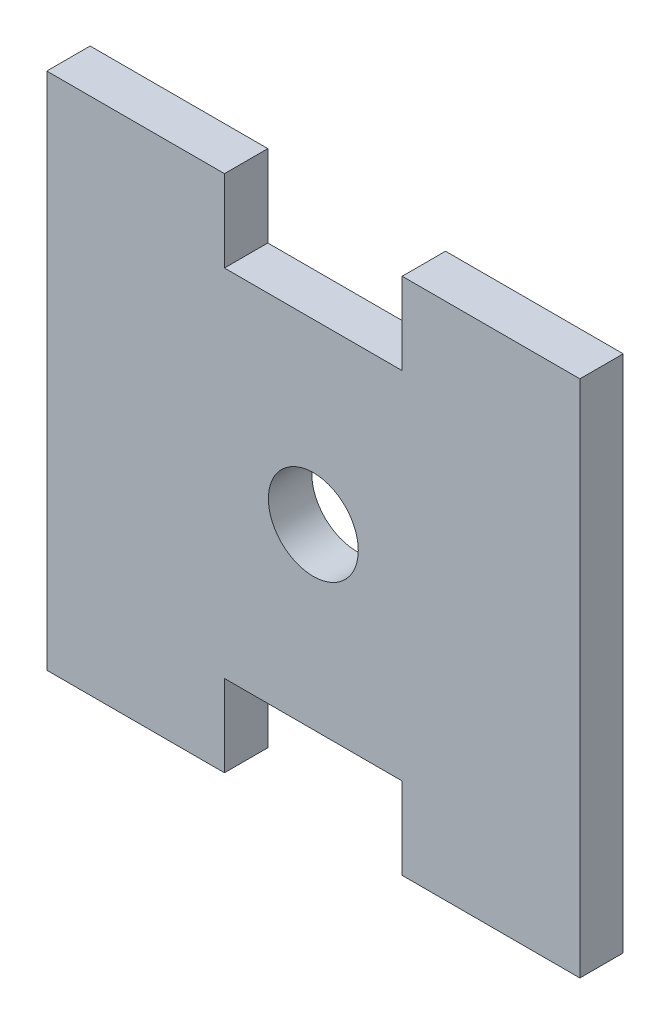
ISO-10303-21;
HEADER;
FILE_DESCRIPTION(('STEP AP214'),'2;1');
FILE_NAME('part.step','',(''),(''),'','','');
FILE_SCHEMA(('AUTOMOTIVE_DESIGN { 1 0 10303 214 1 1 1 1 }'));
ENDSEC;
DATA;
#1=APPLICATION_CONTEXT('core data for automotive mechanical design processes');
#2=APPLICATION_PROTOCOL_DEFINITION('international standard','automotive_design',2000,#1);
#3=PRODUCT_CONTEXT('',#1,'mechanical');
#4=PRODUCT('Part','Part','',(#3));
#5=PRODUCT_RELATED_PRODUCT_CATEGORY('part','',(#4));
#6=PRODUCT_DEFINITION_FORMATION('','',#4);
#7=PRODUCT_DEFINITION_CONTEXT('part definition',#1,'design');
#8=PRODUCT_DEFINITION('design','',#6,#7);
#9=PRODUCT_DEFINITION_SHAPE('','',#8);
#10=(LENGTH_UNIT() NAMED_UNIT(*) SI_UNIT(.MILLI.,.METRE.));
#11=(NAMED_UNIT(*) PLANE_ANGLE_UNIT() SI_UNIT($,.RADIAN.));
#12=(NAMED_UNIT(*) SI_UNIT($,.STERADIAN.) SOLID_ANGLE_UNIT());
#13=UNCERTAINTY_MEASURE_WITH_UNIT(LENGTH_MEASURE(1.E-05),#10,'distance_accuracy_value','');
#14=(GEOMETRIC_REPRESENTATION_CONTEXT(3) GLOBAL_UNCERTAINTY_ASSIGNED_CONTEXT((#13)) GLOBAL_UNIT_ASSIGNED_CONTEXT((#10,
#11,#12)) REPRESENTATION_CONTEXT('',''));
#15=CARTESIAN_POINT('',(0.,0.,0.));
#16=DIRECTION('',(0.,0.,1.));
#17=DIRECTION('',(1.,0.,0.));
#18=AXIS2_PLACEMENT_3D('',#15,#16,#17);
#19=CARTESIAN_POINT('',(-19.05,0.,3.0988));
#20=DIRECTION('',(-1.,0.,0.));
#21=DIRECTION('',(0.,-1.,0.));
#22=AXIS2_PLACEMENT_3D('',#19,#20,#21);
#23=PLANE('',#22);
#24=DIRECTION('',(0.,1.,0.));
#25=VECTOR('',#24,1.);
#26=CARTESIAN_POINT('',(-19.05,0.,0.));
#27=LINE('',#26,#25);
#28=CARTESIAN_POINT('',(-19.05,-18.542,0.));
#29=VERTEX_POINT('',#28);
#30=CARTESIAN_POINT('',(-19.05,18.542,0.));
#31=VERTEX_POINT('',#30);
#32=EDGE_CURVE('E156',#29,#31,#27,.T.);
#33=ORIENTED_EDGE('',*,*,#32,.F.);
#34=DIRECTION('',(0.,0.,-1.));
#35=VECTOR('',#34,1.);
#36=CARTESIAN_POINT('',(-19.05,-18.542,3.0988));
#37=LINE('',#36,#35);
#38=CARTESIAN_POINT('',(-19.05,-18.542,3.0988));
#39=VERTEX_POINT('',#38);
#40=EDGE_CURVE('E11',#39,#29,#37,.T.);
#41=ORIENTED_EDGE('',*,*,#40,.F.);
#42=DIRECTION('',(0.,1.,0.));
#43=VECTOR('',#42,1.);
#44=CARTESIAN_POINT('',(-19.05,0.,3.0988));
#45=LINE('',#44,#43);
#46=CARTESIAN_POINT('',(-19.05,18.542,3.0988));
#47=VERTEX_POINT('',#46);
#48=EDGE_CURVE('E268',#39,#47,#45,.T.);
#49=ORIENTED_EDGE('',*,*,#48,.T.);
#50=DIRECTION('',(0.,0.,-1.));
#51=VECTOR('',#50,1.);
#52=CARTESIAN_POINT('',(-19.05,18.542,3.0988));
#53=LINE('',#52,#51);
#54=EDGE_CURVE('E52',#47,#31,#53,.T.);
#55=ORIENTED_EDGE('',*,*,#54,.T.);
#56=EDGE_LOOP('',(#33,#41,#49,#55));
#57=FACE_BOUND('',#56,.T.);
#58=ADVANCED_FACE('F35',(#57),#23,.T.);
#59=CARTESIAN_POINT('',(0.,-18.542,3.0988));
#60=DIRECTION('',(0.,1.,0.));
#61=DIRECTION('',(0.,0.,1.));
#62=AXIS2_PLACEMENT_3D('',#59,#60,#61);
#63=PLANE('',#62);
#64=DIRECTION('',(1.,0.,0.));
#65=VECTOR('',#64,1.);
#66=CARTESIAN_POINT('',(0.,-18.542,0.));
#67=LINE('',#66,#65);
#68=CARTESIAN_POINT('',(-6.35,-18.542,0.));
#69=VERTEX_POINT('',#68);
#70=EDGE_CURVE('E158',#29,#69,#67,.T.);
#71=ORIENTED_EDGE('',*,*,#70,.T.);
#72=DIRECTION('',(0.,0.,-1.));
#73=VECTOR('',#72,1.);
#74=CARTESIAN_POINT('',(-6.35,-18.542,3.0988));
#75=LINE('',#74,#73);
#76=CARTESIAN_POINT('',(-6.35,-18.542,3.0988));
#77=VERTEX_POINT('',#76);
#78=EDGE_CURVE('E44',#77,#69,#75,.T.);
#79=ORIENTED_EDGE('',*,*,#78,.F.);
#80=DIRECTION('',(1.,0.,0.));
#81=VECTOR('',#80,1.);
#82=CARTESIAN_POINT('',(0.,-18.542,3.0988));
#83=LINE('',#82,#81);
#84=EDGE_CURVE('E270',#39,#77,#83,.T.);
#85=ORIENTED_EDGE('',*,*,#84,.F.);
#86=ORIENTED_EDGE('',*,*,#40,.T.);
#87=EDGE_LOOP('',(#71,#79,#85,#86));
#88=FACE_BOUND('',#87,.T.);
#89=ADVANCED_FACE('F216',(#88),#63,.F.);
#90=CARTESIAN_POINT('',(-6.35,0.,3.0988));
#91=DIRECTION('',(-1.,0.,0.));
#92=DIRECTION('',(0.,0.,1.));
#93=AXIS2_PLACEMENT_3D('',#90,#91,#92);
#94=PLANE('',#93);
#95=DIRECTION('',(0.,1.,0.));
#96=VECTOR('',#95,1.);
#97=CARTESIAN_POINT('',(-6.35,0.,0.));
#98=LINE('',#97,#96);
#99=CARTESIAN_POINT('',(-6.35,-12.7,0.));
#100=VERTEX_POINT('',#99);
#101=EDGE_CURVE('E161',#69,#100,#98,.T.);
#102=ORIENTED_EDGE('',*,*,#101,.T.);
#103=DIRECTION('',(0.,0.,-1.));
#104=VECTOR('',#103,1.);
#105=CARTESIAN_POINT('',(-6.35,-12.7,3.0988));
#106=LINE('',#105,#104);
#107=CARTESIAN_POINT('',(-6.35,-12.7,3.0988));
#108=VERTEX_POINT('',#107);
#109=EDGE_CURVE('E204',#108,#100,#106,.T.);
#110=ORIENTED_EDGE('',*,*,#109,.F.);
#111=DIRECTION('',(0.,1.,0.));
#112=VECTOR('',#111,1.);
#113=CARTESIAN_POINT('',(-6.35,0.,3.0988));
#114=LINE('',#113,#112);
#115=EDGE_CURVE('E212',#77,#108,#114,.T.);
#116=ORIENTED_EDGE('',*,*,#115,.F.);
#117=ORIENTED_EDGE('',*,*,#78,.T.);
#118=EDGE_LOOP('',(#102,#110,#116,#117));
#119=FACE_BOUND('',#118,.T.);
#120=ADVANCED_FACE('F209',(#119),#94,.F.);
#121=CARTESIAN_POINT('',(0.,-12.7,3.0988));
#122=DIRECTION('',(0.,1.,0.));
#123=DIRECTION('',(0.,0.,1.));
#124=AXIS2_PLACEMENT_3D('',#121,#122,#123);
#125=PLANE('',#124);
#126=DIRECTION('',(1.,0.,0.));
#127=VECTOR('',#126,1.);
#128=CARTESIAN_POINT('',(0.,-12.7,0.));
#129=LINE('',#128,#127);
#130=CARTESIAN_POINT('',(6.35,-12.7,0.));
#131=VERTEX_POINT('',#130);
#132=EDGE_CURVE('E164',#100,#131,#129,.T.);
#133=ORIENTED_EDGE('',*,*,#132,.T.);
#134=DIRECTION('',(0.,0.,-1.));
#135=VECTOR('',#134,1.);
#136=CARTESIAN_POINT('',(6.35,-12.7,3.0988));
#137=LINE('',#136,#135);
#138=CARTESIAN_POINT('',(6.35,-12.7,3.0988));
#139=VERTEX_POINT('',#138);
#140=EDGE_CURVE('E202',#139,#131,#137,.T.);
#141=ORIENTED_EDGE('',*,*,#140,.F.);
#142=DIRECTION('',(1.,0.,0.));
#143=VECTOR('',#142,1.);
#144=CARTESIAN_POINT('',(0.,-12.7,3.0988));
#145=LINE('',#144,#143);
#146=EDGE_CURVE('E275',#108,#139,#145,.T.);
#147=ORIENTED_EDGE('',*,*,#146,.F.);
#148=ORIENTED_EDGE('',*,*,#109,.T.);
#149=EDGE_LOOP('',(#133,#141,#147,#148));
#150=FACE_BOUND('',#149,.T.);
#151=ADVANCED_FACE('F227',(#150),#125,.F.);
#152=CARTESIAN_POINT('',(6.35,0.,3.0988));
#153=DIRECTION('',(-1.,0.,0.));
#154=DIRECTION('',(0.,0.,1.));
#155=AXIS2_PLACEMENT_3D('',#152,#153,#154);
#156=PLANE('',#155);
#157=DIRECTION('',(0.,1.,0.));
#158=VECTOR('',#157,1.);
#159=CARTESIAN_POINT('',(6.35,0.,0.));
#160=LINE('',#159,#158);
#161=CARTESIAN_POINT('',(6.35,-18.542,0.));
#162=VERTEX_POINT('',#161);
#163=EDGE_CURVE('E167',#162,#131,#160,.T.);
#164=ORIENTED_EDGE('',*,*,#163,.F.);
#165=DIRECTION('',(0.,0.,-1.));
#166=VECTOR('',#165,1.);
#167=CARTESIAN_POINT('',(6.35,-18.542,3.0988));
#168=LINE('',#167,#166);
#169=CARTESIAN_POINT('',(6.35,-18.542,3.0988));
#170=VERTEX_POINT('',#169);
#171=EDGE_CURVE('E200',#170,#162,#168,.T.);
#172=ORIENTED_EDGE('',*,*,#171,.F.);
#173=DIRECTION('',(0.,1.,0.));
#174=VECTOR('',#173,1.);
#175=CARTESIAN_POINT('',(6.35,0.,3.0988));
#176=LINE('',#175,#174);
#177=EDGE_CURVE('E277',#170,#139,#176,.T.);
#178=ORIENTED_EDGE('',*,*,#177,.T.);
#179=ORIENTED_EDGE('',*,*,#140,.T.);
#180=EDGE_LOOP('',(#164,#172,#178,#179));
#181=FACE_BOUND('',#180,.T.);
#182=ADVANCED_FACE('F230',(#181),#156,.T.);
#183=CARTESIAN_POINT('',(0.,-18.542,3.0988));
#184=DIRECTION('',(0.,-1.,0.));
#185=DIRECTION('',(0.,0.,-1.));
#186=AXIS2_PLACEMENT_3D('',#183,#184,#185);
#187=PLANE('',#186);
#188=DIRECTION('',(-1.,0.,0.));
#189=VECTOR('',#188,1.);
#190=CARTESIAN_POINT('',(0.,-18.542,0.));
#191=LINE('',#190,#189);
#192=CARTESIAN_POINT('',(19.05,-18.542,0.));
#193=VERTEX_POINT('',#192);
#194=EDGE_CURVE('E170',#193,#162,#191,.T.);
#195=ORIENTED_EDGE('',*,*,#194,.F.);
#196=DIRECTION('',(0.,0.,-1.));
#197=VECTOR('',#196,1.);
#198=CARTESIAN_POINT('',(19.05,-18.542,3.0988));
#199=LINE('',#198,#197);
#200=CARTESIAN_POINT('',(19.05,-18.542,3.0988));
#201=VERTEX_POINT('',#200);
#202=EDGE_CURVE('E198',#201,#193,#199,.T.);
#203=ORIENTED_EDGE('',*,*,#202,.F.);
#204=DIRECTION('',(-1.,0.,0.));
#205=VECTOR('',#204,1.);
#206=CARTESIAN_POINT('',(0.,-18.542,3.0988));
#207=LINE('',#206,#205);
#208=EDGE_CURVE('E280',#201,#170,#207,.T.);
#209=ORIENTED_EDGE('',*,*,#208,.T.);
#210=ORIENTED_EDGE('',*,*,#171,.T.);
#211=EDGE_LOOP('',(#195,#203,#209,#210));
#212=FACE_BOUND('',#211,.T.);
#213=ADVANCED_FACE('F234',(#212),#187,.T.);
#214=CARTESIAN_POINT('',(19.05,0.,3.0988));
#215=DIRECTION('',(-1.,0.,0.));
#216=DIRECTION('',(0.,-1.,0.));
#217=AXIS2_PLACEMENT_3D('',#214,#215,#216);
#218=PLANE('',#217);
#219=DIRECTION('',(0.,1.,0.));
#220=VECTOR('',#219,1.);
#221=CARTESIAN_POINT('',(19.05,0.,0.));
#222=LINE('',#221,#220);
#223=CARTESIAN_POINT('',(19.05,18.542,0.));
#224=VERTEX_POINT('',#223);
#225=EDGE_CURVE('E173',#193,#224,#222,.T.);
#226=ORIENTED_EDGE('',*,*,#225,.T.);
#227=DIRECTION('',(0.,0.,-1.));
#228=VECTOR('',#227,1.);
#229=CARTESIAN_POINT('',(19.05,18.542,3.0988));
#230=LINE('',#229,#228);
#231=CARTESIAN_POINT('',(19.05,18.542,3.0988));
#232=VERTEX_POINT('',#231);
#233=EDGE_CURVE('E195',#232,#224,#230,.T.);
#234=ORIENTED_EDGE('',*,*,#233,.F.);
#235=DIRECTION('',(0.,1.,0.));
#236=VECTOR('',#235,1.);
#237=CARTESIAN_POINT('',(19.05,0.,3.0988));
#238=LINE('',#237,#236);
#239=EDGE_CURVE('E283',#201,#232,#238,.T.);
#240=ORIENTED_EDGE('',*,*,#239,.F.);
#241=ORIENTED_EDGE('',*,*,#202,.T.);
#242=EDGE_LOOP('',(#226,#234,#240,#241));
#243=FACE_BOUND('',#242,.T.);
#244=ADVANCED_FACE('F238',(#243),#218,.F.);
#245=CARTESIAN_POINT('',(0.,18.542,3.0988));
#246=DIRECTION('',(0.,-1.,0.));
#247=DIRECTION('',(0.,0.,-1.));
#248=AXIS2_PLACEMENT_3D('',#245,#246,#247);
#249=PLANE('',#248);
#250=DIRECTION('',(-1.,0.,0.));
#251=VECTOR('',#250,1.);
#252=CARTESIAN_POINT('',(0.,18.542,0.));
#253=LINE('',#252,#251);
#254=CARTESIAN_POINT('',(6.35,18.542,0.));
#255=VERTEX_POINT('',#254);
#256=EDGE_CURVE('E176',#224,#255,#253,.T.);
#257=ORIENTED_EDGE('',*,*,#256,.T.);
#258=DIRECTION('',(0.,0.,-1.));
#259=VECTOR('',#258,1.);
#260=CARTESIAN_POINT('',(6.35,18.542,3.0988));
#261=LINE('',#260,#259);
#262=CARTESIAN_POINT('',(6.35,18.542,3.0988));
#263=VERTEX_POINT('',#262);
#264=EDGE_CURVE('E192',#263,#255,#261,.T.);
#265=ORIENTED_EDGE('',*,*,#264,.F.);
#266=DIRECTION('',(-1.,0.,0.));
#267=VECTOR('',#266,1.);
#268=CARTESIAN_POINT('',(0.,18.542,3.0988));
#269=LINE('',#268,#267);
#270=EDGE_CURVE('E286',#232,#263,#269,.T.);
#271=ORIENTED_EDGE('',*,*,#270,.F.);
#272=ORIENTED_EDGE('',*,*,#233,.T.);
#273=EDGE_LOOP('',(#257,#265,#271,#272));
#274=FACE_BOUND('',#273,.T.);
#275=ADVANCED_FACE('F242',(#274),#249,.F.);
#276=CARTESIAN_POINT('',(6.35,0.,3.0988));
#277=DIRECTION('',(1.,0.,0.));
#278=DIRECTION('',(0.,0.,-1.));
#279=AXIS2_PLACEMENT_3D('',#276,#277,#278);
#280=PLANE('',#279);
#281=DIRECTION('',(0.,-1.,0.));
#282=VECTOR('',#281,1.);
#283=CARTESIAN_POINT('',(6.35,0.,0.));
#284=LINE('',#283,#282);
#285=CARTESIAN_POINT('',(6.35,12.7,0.));
#286=VERTEX_POINT('',#285);
#287=EDGE_CURVE('E179',#255,#286,#284,.T.);
#288=ORIENTED_EDGE('',*,*,#287,.T.);
#289=DIRECTION('',(0.,0.,-1.));
#290=VECTOR('',#289,1.);
#291=CARTESIAN_POINT('',(6.35,12.7,3.0988));
#292=LINE('',#291,#290);
#293=CARTESIAN_POINT('',(6.35,12.7,3.0988));
#294=VERTEX_POINT('',#293);
#295=EDGE_CURVE('E135',#294,#286,#292,.T.);
#296=ORIENTED_EDGE('',*,*,#295,.F.);
#297=DIRECTION('',(0.,-1.,0.));
#298=VECTOR('',#297,1.);
#299=CARTESIAN_POINT('',(6.35,0.,3.0988));
#300=LINE('',#299,#298);
#301=EDGE_CURVE('E144',#263,#294,#300,.T.);
#302=ORIENTED_EDGE('',*,*,#301,.F.);
#303=ORIENTED_EDGE('',*,*,#264,.T.);
#304=EDGE_LOOP('',(#288,#296,#302,#303));
#305=FACE_BOUND('',#304,.T.);
#306=ADVANCED_FACE('F246',(#305),#280,.F.);
#307=CARTESIAN_POINT('',(0.,12.7,3.0988));
#308=DIRECTION('',(0.,1.,0.));
#309=DIRECTION('',(0.,0.,1.));
#310=AXIS2_PLACEMENT_3D('',#307,#308,#309);
#311=PLANE('',#310);
#312=DIRECTION('',(1.,0.,0.));
#313=VECTOR('',#312,1.);
#314=CARTESIAN_POINT('',(0.,12.7,0.));
#315=LINE('',#314,#313);
#316=CARTESIAN_POINT('',(-6.35,12.7,0.));
#317=VERTEX_POINT('',#316);
#318=EDGE_CURVE('E131',#317,#286,#315,.T.);
#319=ORIENTED_EDGE('',*,*,#318,.F.);
#320=DIRECTION('',(0.,0.,-1.));
#321=VECTOR('',#320,1.);
#322=CARTESIAN_POINT('',(-6.35,12.7,3.0988));
#323=LINE('',#322,#321);
#324=CARTESIAN_POINT('',(-6.35,12.7,3.0988));
#325=VERTEX_POINT('',#324);
#326=EDGE_CURVE('E126',#325,#317,#323,.T.);
#327=ORIENTED_EDGE('',*,*,#326,.F.);
#328=DIRECTION('',(1.,0.,0.));
#329=VECTOR('',#328,1.);
#330=CARTESIAN_POINT('',(0.,12.7,3.0988));
#331=LINE('',#330,#329);
#332=EDGE_CURVE('E129',#325,#294,#331,.T.);
#333=ORIENTED_EDGE('',*,*,#332,.T.);
#334=ORIENTED_EDGE('',*,*,#295,.T.);
#335=EDGE_LOOP('',(#319,#327,#333,#334));
#336=FACE_BOUND('',#335,.T.);
#337=ADVANCED_FACE('F128',(#336),#311,.T.);
#338=CARTESIAN_POINT('',(-6.35,0.,3.0988));
#339=DIRECTION('',(1.,0.,0.));
#340=DIRECTION('',(0.,0.,-1.));
#341=AXIS2_PLACEMENT_3D('',#338,#339,#340);
#342=PLANE('',#341);
#343=DIRECTION('',(0.,-1.,0.));
#344=VECTOR('',#343,1.);
#345=CARTESIAN_POINT('',(-6.35,0.,0.));
#346=LINE('',#345,#344);
#347=CARTESIAN_POINT('',(-6.35,18.542,0.));
#348=VERTEX_POINT('',#347);
#349=EDGE_CURVE('E183',#348,#317,#346,.T.);
#350=ORIENTED_EDGE('',*,*,#349,.F.);
#351=DIRECTION('',(0.,0.,-1.));
#352=VECTOR('',#351,1.);
#353=CARTESIAN_POINT('',(-6.35,18.542,3.0988));
#354=LINE('',#353,#352);
#355=CARTESIAN_POINT('',(-6.35,18.542,3.0988));
#356=VERTEX_POINT('',#355);
#357=EDGE_CURVE('E89',#356,#348,#354,.T.);
#358=ORIENTED_EDGE('',*,*,#357,.F.);
#359=DIRECTION('',(0.,-1.,0.));
#360=VECTOR('',#359,1.);
#361=CARTESIAN_POINT('',(-6.35,0.,3.0988));
#362=LINE('',#361,#360);
#363=EDGE_CURVE('E142',#356,#325,#362,.T.);
#364=ORIENTED_EDGE('',*,*,#363,.T.);
#365=ORIENTED_EDGE('',*,*,#326,.T.);
#366=EDGE_LOOP('',(#350,#358,#364,#365));
#367=FACE_BOUND('',#366,.T.);
#368=ADVANCED_FACE('F147',(#367),#342,.T.);
#369=CARTESIAN_POINT('',(0.,0.,3.0988));
#370=DIRECTION('',(0.,0.,-1.));
#371=DIRECTION('',(-1.,0.,0.));
#372=AXIS2_PLACEMENT_3D('',#369,#370,#371);
#373=CYLINDRICAL_SURFACE('',#372,3.2131);
#374=CARTESIAN_POINT('',(0.,0.,3.0988));
#375=DIRECTION('',(0.,0.,1.));
#376=DIRECTION('',(1.,0.,0.));
#377=AXIS2_PLACEMENT_3D('',#374,#375,#376);
#378=CIRCLE('',#377,3.2131);
#379=CARTESIAN_POINT('',(3.2131,0.,3.0988));
#380=VERTEX_POINT('',#379);
#381=EDGE_CURVE('E188',#380,#380,#378,.T.);
#382=ORIENTED_EDGE('',*,*,#381,.T.);
#383=EDGE_LOOP('',(#382));
#384=FACE_BOUND('',#383,.T.);
#385=CARTESIAN_POINT('',(0.,0.,0.));
#386=DIRECTION('',(0.,0.,1.));
#387=DIRECTION('',(1.,0.,0.));
#388=AXIS2_PLACEMENT_3D('',#385,#386,#387);
#389=CIRCLE('',#388,3.2131);
#390=CARTESIAN_POINT('',(3.2131,0.,0.));
#391=VERTEX_POINT('',#390);
#392=EDGE_CURVE('E153',#391,#391,#389,.T.);
#393=ORIENTED_EDGE('',*,*,#392,.F.);
#394=EDGE_LOOP('',(#393));
#395=FACE_BOUND('',#394,.T.);
#396=ADVANCED_FACE('F37',(#384,#395),#373,.F.);
#397=CARTESIAN_POINT('',(0.,18.542,3.0988));
#398=DIRECTION('',(0.,1.,0.));
#399=DIRECTION('',(0.,0.,1.));
#400=AXIS2_PLACEMENT_3D('',#397,#398,#399);
#401=PLANE('',#400);
#402=DIRECTION('',(1.,0.,0.));
#403=VECTOR('',#402,1.);
#404=CARTESIAN_POINT('',(0.,18.542,0.));
#405=LINE('',#404,#403);
#406=EDGE_CURVE('E185',#31,#348,#405,.T.);
#407=ORIENTED_EDGE('',*,*,#406,.F.);
#408=ORIENTED_EDGE('',*,*,#54,.F.);
#409=DIRECTION('',(1.,0.,0.));
#410=VECTOR('',#409,1.);
#411=CARTESIAN_POINT('',(0.,18.542,3.0988));
#412=LINE('',#411,#410);
#413=EDGE_CURVE('E148',#47,#356,#412,.T.);
#414=ORIENTED_EDGE('',*,*,#413,.T.);
#415=ORIENTED_EDGE('',*,*,#357,.T.);
#416=EDGE_LOOP('',(#407,#408,#414,#415));
#417=FACE_BOUND('',#416,.T.);
#418=ADVANCED_FACE('F255',(#417),#401,.T.);
#419=CARTESIAN_POINT('',(0.,0.,3.0988));
#420=DIRECTION('',(0.,0.,1.));
#421=DIRECTION('',(1.,0.,0.));
#422=AXIS2_PLACEMENT_3D('',#419,#420,#421);
#423=PLANE('',#422);
#424=ORIENTED_EDGE('',*,*,#381,.F.);
#425=EDGE_LOOP('',(#424));
#426=FACE_BOUND('',#425,.T.);
#427=ORIENTED_EDGE('',*,*,#48,.F.);
#428=ORIENTED_EDGE('',*,*,#84,.T.);
#429=ORIENTED_EDGE('',*,*,#115,.T.);
#430=ORIENTED_EDGE('',*,*,#146,.T.);
#431=ORIENTED_EDGE('',*,*,#177,.F.);
#432=ORIENTED_EDGE('',*,*,#208,.F.);
#433=ORIENTED_EDGE('',*,*,#239,.T.);
#434=ORIENTED_EDGE('',*,*,#270,.T.);
#435=ORIENTED_EDGE('',*,*,#301,.T.);
#436=ORIENTED_EDGE('',*,*,#332,.F.);
#437=ORIENTED_EDGE('',*,*,#363,.F.);
#438=ORIENTED_EDGE('',*,*,#413,.F.);
#439=EDGE_LOOP('',(#427,#428,#429,#430,#431,#432,#433,#434,#435,#436,#437,#438));
#440=FACE_BOUND('',#439,.T.);
#441=ADVANCED_FACE('F140',(#426,#440),#423,.T.);
#442=CARTESIAN_POINT('',(0.,0.,0.));
#443=DIRECTION('',(0.,0.,1.));
#444=DIRECTION('',(1.,0.,0.));
#445=AXIS2_PLACEMENT_3D('',#442,#443,#444);
#446=PLANE('',#445);
#447=ORIENTED_EDGE('',*,*,#392,.T.);
#448=EDGE_LOOP('',(#447));
#449=FACE_BOUND('',#448,.T.);
#450=ORIENTED_EDGE('',*,*,#32,.T.);
#451=ORIENTED_EDGE('',*,*,#406,.T.);
#452=ORIENTED_EDGE('',*,*,#349,.T.);
#453=ORIENTED_EDGE('',*,*,#318,.T.);
#454=ORIENTED_EDGE('',*,*,#287,.F.);
#455=ORIENTED_EDGE('',*,*,#256,.F.);
#456=ORIENTED_EDGE('',*,*,#225,.F.);
#457=ORIENTED_EDGE('',*,*,#194,.T.);
#458=ORIENTED_EDGE('',*,*,#163,.T.);
#459=ORIENTED_EDGE('',*,*,#132,.F.);
#460=ORIENTED_EDGE('',*,*,#101,.F.);
#461=ORIENTED_EDGE('',*,*,#70,.F.);
#462=EDGE_LOOP('',(#450,#451,#452,#453,#454,#455,#456,#457,#458,#459,#460,#461));
#463=FACE_BOUND('',#462,.T.);
#464=ADVANCED_FACE('F218',(#449,#463),#446,.F.);
#465=CLOSED_SHELL('',(#58,#89,#120,#151,#182,#213,#244,#275,#306,#337,#368,#396,#418,#441,#464));
#466=MANIFOLD_SOLID_BREP('B2',#465);
#467=ADVANCED_BREP_SHAPE_REPRESENTATION('',(#18,#466),#14);
#468=SHAPE_DEFINITION_REPRESENTATION(#9,#467);
ENDSEC;
END-ISO-10303-21;
